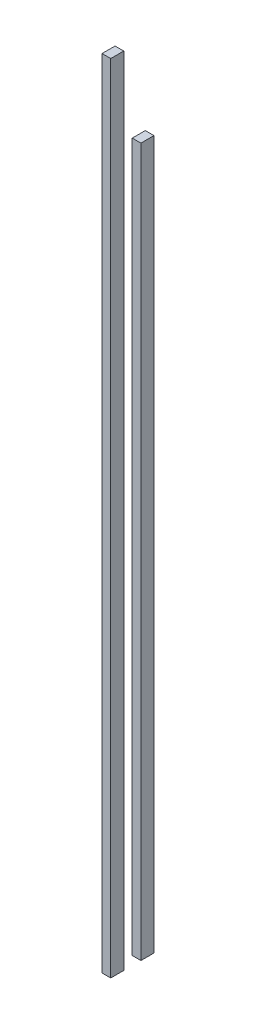
ISO-10303-21;
HEADER;
FILE_DESCRIPTION(('STEP AP214'),'2;1');
FILE_NAME('part.step','',(''),(''),'','','');
FILE_SCHEMA(('AUTOMOTIVE_DESIGN { 1 0 10303 214 1 1 1 1 }'));
ENDSEC;
DATA;
#1=APPLICATION_CONTEXT('core data for automotive mechanical design processes');
#2=APPLICATION_PROTOCOL_DEFINITION('international standard','automotive_design',2000,#1);
#3=PRODUCT_CONTEXT('',#1,'mechanical');
#4=PRODUCT('Part','Part','',(#3));
#5=PRODUCT_RELATED_PRODUCT_CATEGORY('part','',(#4));
#6=PRODUCT_DEFINITION_FORMATION('','',#4);
#7=PRODUCT_DEFINITION_CONTEXT('part definition',#1,'design');
#8=PRODUCT_DEFINITION('design','',#6,#7);
#9=PRODUCT_DEFINITION_SHAPE('','',#8);
#10=(LENGTH_UNIT() NAMED_UNIT(*) SI_UNIT(.MILLI.,.METRE.));
#11=(NAMED_UNIT(*) PLANE_ANGLE_UNIT() SI_UNIT($,.RADIAN.));
#12=(NAMED_UNIT(*) SI_UNIT($,.STERADIAN.) SOLID_ANGLE_UNIT());
#13=UNCERTAINTY_MEASURE_WITH_UNIT(LENGTH_MEASURE(1.E-05),#10,'distance_accuracy_value','');
#14=(GEOMETRIC_REPRESENTATION_CONTEXT(3) GLOBAL_UNCERTAINTY_ASSIGNED_CONTEXT((#13)) GLOBAL_UNIT_ASSIGNED_CONTEXT((#10,
#11,#12)) REPRESENTATION_CONTEXT('',''));
#15=CARTESIAN_POINT('',(0.,0.,0.));
#16=DIRECTION('',(0.,0.,1.));
#17=DIRECTION('',(1.,0.,0.));
#18=AXIS2_PLACEMENT_3D('',#15,#16,#17);
#19=CARTESIAN_POINT('',(-4.3,-48.,-0.746777409181598));
#20=DIRECTION('',(0.,-1.,0.));
#21=DIRECTION('',(0.,0.,-1.));
#22=AXIS2_PLACEMENT_3D('',#19,#20,#21);
#23=PLANE('',#22);
#24=DIRECTION('',(0.,0.,-1.));
#25=VECTOR('',#24,1.);
#26=CARTESIAN_POINT('',(-3.1,-48.,-0.746777409181598));
#27=LINE('',#26,#25);
#28=CARTESIAN_POINT('',(-3.1,-48.,-0.746777409181598));
#29=VERTEX_POINT('',#28);
#30=CARTESIAN_POINT('',(-3.1,-48.,-2.5467774091816));
#31=VERTEX_POINT('',#30);
#32=EDGE_CURVE('E99',#29,#31,#27,.T.);
#33=ORIENTED_EDGE('',*,*,#32,.F.);
#34=DIRECTION('',(1.,0.,0.));
#35=VECTOR('',#34,1.);
#36=CARTESIAN_POINT('',(-4.3,-48.,-0.746777409181598));
#37=LINE('',#36,#35);
#38=CARTESIAN_POINT('',(-4.3,-48.,-0.746777409181598));
#39=VERTEX_POINT('',#38);
#40=EDGE_CURVE('E57',#39,#29,#37,.T.);
#41=ORIENTED_EDGE('',*,*,#40,.F.);
#42=DIRECTION('',(0.,0.,-1.));
#43=VECTOR('',#42,1.);
#44=CARTESIAN_POINT('',(-4.3,-48.,-0.746777409181598));
#45=LINE('',#44,#43);
#46=CARTESIAN_POINT('',(-4.3,-48.,-2.5467774091816));
#47=VERTEX_POINT('',#46);
#48=EDGE_CURVE('E97',#39,#47,#45,.T.);
#49=ORIENTED_EDGE('',*,*,#48,.T.);
#50=DIRECTION('',(1.,0.,0.));
#51=VECTOR('',#50,1.);
#52=CARTESIAN_POINT('',(-4.3,-48.,-2.5467774091816));
#53=LINE('',#52,#51);
#54=EDGE_CURVE('E12',#47,#31,#53,.T.);
#55=ORIENTED_EDGE('',*,*,#54,.T.);
#56=EDGE_LOOP('',(#33,#41,#49,#55));
#57=FACE_BOUND('',#56,.T.);
#58=ADVANCED_FACE('F49',(#57),#23,.T.);
#59=CARTESIAN_POINT('',(-4.3,49.7863090848361,-0.74677740918161));
#60=DIRECTION('',(0.,0.,1.));
#61=DIRECTION('',(1.,0.,0.));
#62=AXIS2_PLACEMENT_3D('',#59,#60,#61);
#63=PLANE('',#62);
#64=DIRECTION('',(0.,1.,0.));
#65=VECTOR('',#64,1.);
#66=CARTESIAN_POINT('',(-3.1,49.7863090848361,-0.74677740918161));
#67=LINE('',#66,#65);
#68=CARTESIAN_POINT('',(-3.1,49.8863090848361,-0.74677740918161));
#69=VERTEX_POINT('',#68);
#70=EDGE_CURVE('E112',#69,#29,#67,.F.);
#71=ORIENTED_EDGE('',*,*,#70,.F.);
#72=DIRECTION('',(1.,0.,0.));
#73=VECTOR('',#72,1.);
#74=CARTESIAN_POINT('',(-4.3,49.8863090848361,-0.74677740918161));
#75=LINE('',#74,#73);
#76=CARTESIAN_POINT('',(-4.3,49.8863090848361,-0.74677740918161));
#77=VERTEX_POINT('',#76);
#78=EDGE_CURVE('E83',#77,#69,#75,.T.);
#79=ORIENTED_EDGE('',*,*,#78,.F.);
#80=DIRECTION('',(0.,-1.,0.));
#81=VECTOR('',#80,1.);
#82=CARTESIAN_POINT('',(-4.3,49.7863090848361,-0.74677740918161));
#83=LINE('',#82,#81);
#84=EDGE_CURVE('E103',#77,#39,#83,.T.);
#85=ORIENTED_EDGE('',*,*,#84,.T.);
#86=ORIENTED_EDGE('',*,*,#40,.T.);
#87=EDGE_LOOP('',(#71,#79,#85,#86));
#88=FACE_BOUND('',#87,.T.);
#89=ADVANCED_FACE('F105',(#88),#63,.T.);
#90=CARTESIAN_POINT('',(-4.3,49.8863090848361,-2.54677740918161));
#91=DIRECTION('',(0.,1.,0.));
#92=DIRECTION('',(0.,0.,1.));
#93=AXIS2_PLACEMENT_3D('',#90,#91,#92);
#94=PLANE('',#93);
#95=DIRECTION('',(0.,0.,1.));
#96=VECTOR('',#95,1.);
#97=CARTESIAN_POINT('',(-3.1,49.8863090848361,-2.54677740918161));
#98=LINE('',#97,#96);
#99=CARTESIAN_POINT('',(-3.1,49.8863090848361,-2.54677740918161));
#100=VERTEX_POINT('',#99);
#101=EDGE_CURVE('E114',#100,#69,#98,.T.);
#102=ORIENTED_EDGE('',*,*,#101,.F.);
#103=DIRECTION('',(1.,0.,0.));
#104=VECTOR('',#103,1.);
#105=CARTESIAN_POINT('',(-4.3,49.8863090848361,-2.54677740918161));
#106=LINE('',#105,#104);
#107=CARTESIAN_POINT('',(-4.3,49.8863090848361,-2.54677740918161));
#108=VERTEX_POINT('',#107);
#109=EDGE_CURVE('E86',#108,#100,#106,.T.);
#110=ORIENTED_EDGE('',*,*,#109,.F.);
#111=DIRECTION('',(0.,0.,1.));
#112=VECTOR('',#111,1.);
#113=CARTESIAN_POINT('',(-4.3,49.8863090848361,-2.54677740918161));
#114=LINE('',#113,#112);
#115=EDGE_CURVE('E106',#108,#77,#114,.T.);
#116=ORIENTED_EDGE('',*,*,#115,.T.);
#117=ORIENTED_EDGE('',*,*,#78,.T.);
#118=EDGE_LOOP('',(#102,#110,#116,#117));
#119=FACE_BOUND('',#118,.T.);
#120=ADVANCED_FACE('F123',(#119),#94,.T.);
#121=CARTESIAN_POINT('',(-4.3,49.7863090848361,-2.54677740918161));
#122=DIRECTION('',(0.,0.,1.));
#123=DIRECTION('',(1.,0.,0.));
#124=AXIS2_PLACEMENT_3D('',#121,#122,#123);
#125=PLANE('',#124);
#126=DIRECTION('',(0.,1.,0.));
#127=VECTOR('',#126,1.);
#128=CARTESIAN_POINT('',(-3.1,49.7863090848361,-2.54677740918161));
#129=LINE('',#128,#127);
#130=EDGE_CURVE('E117',#100,#31,#129,.F.);
#131=ORIENTED_EDGE('',*,*,#130,.T.);
#132=ORIENTED_EDGE('',*,*,#54,.F.);
#133=DIRECTION('',(0.,-1.,0.));
#134=VECTOR('',#133,1.);
#135=CARTESIAN_POINT('',(-4.3,49.7863090848361,-2.54677740918161));
#136=LINE('',#135,#134);
#137=EDGE_CURVE('E65',#108,#47,#136,.T.);
#138=ORIENTED_EDGE('',*,*,#137,.F.);
#139=ORIENTED_EDGE('',*,*,#109,.T.);
#140=EDGE_LOOP('',(#131,#132,#138,#139));
#141=FACE_BOUND('',#140,.T.);
#142=ADVANCED_FACE('F120',(#141),#125,.F.);
#143=CARTESIAN_POINT('',(-4.3,0.,0.));
#144=DIRECTION('',(1.,0.,0.));
#145=DIRECTION('',(0.,0.,-1.));
#146=AXIS2_PLACEMENT_3D('',#143,#144,#145);
#147=PLANE('',#146);
#148=ORIENTED_EDGE('',*,*,#137,.T.);
#149=ORIENTED_EDGE('',*,*,#48,.F.);
#150=ORIENTED_EDGE('',*,*,#84,.F.);
#151=ORIENTED_EDGE('',*,*,#115,.F.);
#152=EDGE_LOOP('',(#148,#149,#150,#151));
#153=FACE_BOUND('',#152,.T.);
#154=ADVANCED_FACE('F102',(#153),#147,.F.);
#155=CARTESIAN_POINT('',(-3.1,0.,0.));
#156=DIRECTION('',(1.,0.,0.));
#157=DIRECTION('',(0.,0.,-1.));
#158=AXIS2_PLACEMENT_3D('',#155,#156,#157);
#159=PLANE('',#158);
#160=ORIENTED_EDGE('',*,*,#32,.T.);
#161=ORIENTED_EDGE('',*,*,#130,.F.);
#162=ORIENTED_EDGE('',*,*,#101,.T.);
#163=ORIENTED_EDGE('',*,*,#70,.T.);
#164=EDGE_LOOP('',(#160,#161,#162,#163));
#165=FACE_BOUND('',#164,.T.);
#166=ADVANCED_FACE('F122',(#165),#159,.T.);
#167=CLOSED_SHELL('',(#58,#89,#120,#142,#154,#166));
#168=MANIFOLD_SOLID_BREP('B2',#167);
#169=CARTESIAN_POINT('',(-4.3,-48.,3.42753334230657));
#170=DIRECTION('',(0.,-1.,0.));
#171=DIRECTION('',(0.,0.,-1.));
#172=AXIS2_PLACEMENT_3D('',#169,#170,#171);
#173=PLANE('',#172);
#174=DIRECTION('',(0.,0.,-1.));
#175=VECTOR('',#174,1.);
#176=CARTESIAN_POINT('',(-3.1,-48.,3.42753334230657));
#177=LINE('',#176,#175);
#178=CARTESIAN_POINT('',(-3.1,-48.,3.42753334230657));
#179=VERTEX_POINT('',#178);
#180=CARTESIAN_POINT('',(-3.1,-48.,1.62753334230657));
#181=VERTEX_POINT('',#180);
#182=EDGE_CURVE('E229',#179,#181,#177,.T.);
#183=ORIENTED_EDGE('',*,*,#182,.F.);
#184=DIRECTION('',(1.,0.,0.));
#185=VECTOR('',#184,1.);
#186=CARTESIAN_POINT('',(-4.3,-48.,3.42753334230657));
#187=LINE('',#186,#185);
#188=CARTESIAN_POINT('',(-4.3,-48.,3.42753334230657));
#189=VERTEX_POINT('',#188);
#190=EDGE_CURVE('E187',#189,#179,#187,.T.);
#191=ORIENTED_EDGE('',*,*,#190,.F.);
#192=DIRECTION('',(0.,0.,-1.));
#193=VECTOR('',#192,1.);
#194=CARTESIAN_POINT('',(-4.3,-48.,3.42753334230657));
#195=LINE('',#194,#193);
#196=CARTESIAN_POINT('',(-4.3,-48.,1.62753334230657));
#197=VERTEX_POINT('',#196);
#198=EDGE_CURVE('E227',#189,#197,#195,.T.);
#199=ORIENTED_EDGE('',*,*,#198,.T.);
#200=DIRECTION('',(1.,0.,0.));
#201=VECTOR('',#200,1.);
#202=CARTESIAN_POINT('',(-4.3,-48.,1.62753334230657));
#203=LINE('',#202,#201);
#204=EDGE_CURVE('E47',#197,#181,#203,.T.);
#205=ORIENTED_EDGE('',*,*,#204,.T.);
#206=EDGE_LOOP('',(#183,#191,#199,#205));
#207=FACE_BOUND('',#206,.T.);
#208=ADVANCED_FACE('F179',(#207),#173,.T.);
#209=CARTESIAN_POINT('',(-4.3,62.,3.42753334230656));
#210=DIRECTION('',(0.,0.,1.));
#211=DIRECTION('',(1.,0.,0.));
#212=AXIS2_PLACEMENT_3D('',#209,#210,#211);
#213=PLANE('',#212);
#214=DIRECTION('',(0.,1.,0.));
#215=VECTOR('',#214,1.);
#216=CARTESIAN_POINT('',(-3.1,62.,3.42753334230656));
#217=LINE('',#216,#215);
#218=CARTESIAN_POINT('',(-3.1,62.1,3.42753334230656));
#219=VERTEX_POINT('',#218);
#220=EDGE_CURVE('E242',#219,#179,#217,.F.);
#221=ORIENTED_EDGE('',*,*,#220,.F.);
#222=DIRECTION('',(1.,0.,0.));
#223=VECTOR('',#222,1.);
#224=CARTESIAN_POINT('',(-4.3,62.1,3.42753334230656));
#225=LINE('',#224,#223);
#226=CARTESIAN_POINT('',(-4.3,62.1,3.42753334230656));
#227=VERTEX_POINT('',#226);
#228=EDGE_CURVE('E213',#227,#219,#225,.T.);
#229=ORIENTED_EDGE('',*,*,#228,.F.);
#230=DIRECTION('',(0.,-1.,0.));
#231=VECTOR('',#230,1.);
#232=CARTESIAN_POINT('',(-4.3,62.,3.42753334230656));
#233=LINE('',#232,#231);
#234=EDGE_CURVE('E233',#227,#189,#233,.T.);
#235=ORIENTED_EDGE('',*,*,#234,.T.);
#236=ORIENTED_EDGE('',*,*,#190,.T.);
#237=EDGE_LOOP('',(#221,#229,#235,#236));
#238=FACE_BOUND('',#237,.T.);
#239=ADVANCED_FACE('F235',(#238),#213,.T.);
#240=CARTESIAN_POINT('',(-4.3,62.1,1.62753334230656));
#241=DIRECTION('',(0.,1.,0.));
#242=DIRECTION('',(0.,0.,1.));
#243=AXIS2_PLACEMENT_3D('',#240,#241,#242);
#244=PLANE('',#243);
#245=DIRECTION('',(0.,0.,1.));
#246=VECTOR('',#245,1.);
#247=CARTESIAN_POINT('',(-3.1,62.1,1.62753334230656));
#248=LINE('',#247,#246);
#249=CARTESIAN_POINT('',(-3.1,62.1,1.62753334230656));
#250=VERTEX_POINT('',#249);
#251=EDGE_CURVE('E244',#250,#219,#248,.T.);
#252=ORIENTED_EDGE('',*,*,#251,.F.);
#253=DIRECTION('',(1.,0.,0.));
#254=VECTOR('',#253,1.);
#255=CARTESIAN_POINT('',(-4.3,62.1,1.62753334230656));
#256=LINE('',#255,#254);
#257=CARTESIAN_POINT('',(-4.3,62.1,1.62753334230656));
#258=VERTEX_POINT('',#257);
#259=EDGE_CURVE('E216',#258,#250,#256,.T.);
#260=ORIENTED_EDGE('',*,*,#259,.F.);
#261=DIRECTION('',(0.,0.,1.));
#262=VECTOR('',#261,1.);
#263=CARTESIAN_POINT('',(-4.3,62.1,1.62753334230656));
#264=LINE('',#263,#262);
#265=EDGE_CURVE('E236',#258,#227,#264,.T.);
#266=ORIENTED_EDGE('',*,*,#265,.T.);
#267=ORIENTED_EDGE('',*,*,#228,.T.);
#268=EDGE_LOOP('',(#252,#260,#266,#267));
#269=FACE_BOUND('',#268,.T.);
#270=ADVANCED_FACE('F253',(#269),#244,.T.);
#271=CARTESIAN_POINT('',(-4.3,62.,1.62753334230656));
#272=DIRECTION('',(0.,0.,1.));
#273=DIRECTION('',(1.,0.,0.));
#274=AXIS2_PLACEMENT_3D('',#271,#272,#273);
#275=PLANE('',#274);
#276=DIRECTION('',(0.,1.,0.));
#277=VECTOR('',#276,1.);
#278=CARTESIAN_POINT('',(-3.1,62.,1.62753334230656));
#279=LINE('',#278,#277);
#280=EDGE_CURVE('E247',#250,#181,#279,.F.);
#281=ORIENTED_EDGE('',*,*,#280,.T.);
#282=ORIENTED_EDGE('',*,*,#204,.F.);
#283=DIRECTION('',(0.,-1.,0.));
#284=VECTOR('',#283,1.);
#285=CARTESIAN_POINT('',(-4.3,62.,1.62753334230656));
#286=LINE('',#285,#284);
#287=EDGE_CURVE('E195',#258,#197,#286,.T.);
#288=ORIENTED_EDGE('',*,*,#287,.F.);
#289=ORIENTED_EDGE('',*,*,#259,.T.);
#290=EDGE_LOOP('',(#281,#282,#288,#289));
#291=FACE_BOUND('',#290,.T.);
#292=ADVANCED_FACE('F250',(#291),#275,.F.);
#293=CARTESIAN_POINT('',(-4.3,0.,0.));
#294=DIRECTION('',(1.,0.,0.));
#295=DIRECTION('',(0.,0.,-1.));
#296=AXIS2_PLACEMENT_3D('',#293,#294,#295);
#297=PLANE('',#296);
#298=ORIENTED_EDGE('',*,*,#287,.T.);
#299=ORIENTED_EDGE('',*,*,#198,.F.);
#300=ORIENTED_EDGE('',*,*,#234,.F.);
#301=ORIENTED_EDGE('',*,*,#265,.F.);
#302=EDGE_LOOP('',(#298,#299,#300,#301));
#303=FACE_BOUND('',#302,.T.);
#304=ADVANCED_FACE('F232',(#303),#297,.F.);
#305=CARTESIAN_POINT('',(-3.1,0.,0.));
#306=DIRECTION('',(1.,0.,0.));
#307=DIRECTION('',(0.,0.,-1.));
#308=AXIS2_PLACEMENT_3D('',#305,#306,#307);
#309=PLANE('',#308);
#310=ORIENTED_EDGE('',*,*,#182,.T.);
#311=ORIENTED_EDGE('',*,*,#280,.F.);
#312=ORIENTED_EDGE('',*,*,#251,.T.);
#313=ORIENTED_EDGE('',*,*,#220,.T.);
#314=EDGE_LOOP('',(#310,#311,#312,#313));
#315=FACE_BOUND('',#314,.T.);
#316=ADVANCED_FACE('F252',(#315),#309,.T.);
#317=CLOSED_SHELL('',(#208,#239,#270,#292,#304,#316));
#318=MANIFOLD_SOLID_BREP('B6',#317);
#319=ADVANCED_BREP_SHAPE_REPRESENTATION('',(#18,#168,#318),#14);
#320=SHAPE_DEFINITION_REPRESENTATION(#9,#319);
ENDSEC;
END-ISO-10303-21;
